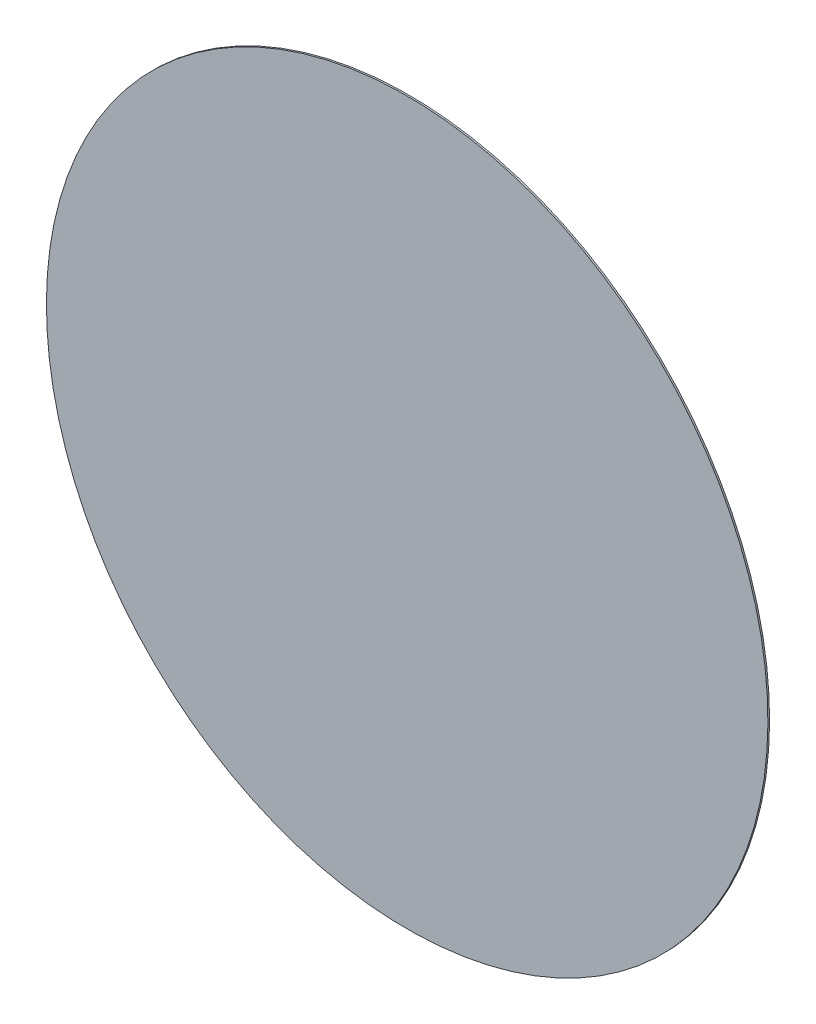
ISO-10303-21;
HEADER;
FILE_DESCRIPTION(('STEP AP214'),'2;1');
FILE_NAME('part.step','',(''),(''),'','','');
FILE_SCHEMA(('AUTOMOTIVE_DESIGN { 1 0 10303 214 1 1 1 1 }'));
ENDSEC;
DATA;
#1=APPLICATION_CONTEXT('core data for automotive mechanical design processes');
#2=APPLICATION_PROTOCOL_DEFINITION('international standard','automotive_design',2000,#1);
#3=PRODUCT_CONTEXT('',#1,'mechanical');
#4=PRODUCT('Part','Part','',(#3));
#5=PRODUCT_RELATED_PRODUCT_CATEGORY('part','',(#4));
#6=PRODUCT_DEFINITION_FORMATION('','',#4);
#7=PRODUCT_DEFINITION_CONTEXT('part definition',#1,'design');
#8=PRODUCT_DEFINITION('design','',#6,#7);
#9=PRODUCT_DEFINITION_SHAPE('','',#8);
#10=(LENGTH_UNIT() NAMED_UNIT(*) SI_UNIT(.MILLI.,.METRE.));
#11=(NAMED_UNIT(*) PLANE_ANGLE_UNIT() SI_UNIT($,.RADIAN.));
#12=(NAMED_UNIT(*) SI_UNIT($,.STERADIAN.) SOLID_ANGLE_UNIT());
#13=UNCERTAINTY_MEASURE_WITH_UNIT(LENGTH_MEASURE(1.E-05),#10,'distance_accuracy_value','');
#14=(GEOMETRIC_REPRESENTATION_CONTEXT(3) GLOBAL_UNCERTAINTY_ASSIGNED_CONTEXT((#13)) GLOBAL_UNIT_ASSIGNED_CONTEXT((#10,
#11,#12)) REPRESENTATION_CONTEXT('',''));
#15=CARTESIAN_POINT('',(0.,0.,0.));
#16=DIRECTION('',(0.,0.,1.));
#17=DIRECTION('',(1.,0.,0.));
#18=AXIS2_PLACEMENT_3D('',#15,#16,#17);
#19=CARTESIAN_POINT('',(17.193,-23.719,0.173));
#20=DIRECTION('',(0.,0.,-1.));
#21=DIRECTION('',(-1.,0.,0.));
#22=AXIS2_PLACEMENT_3D('',#19,#20,#21);
#23=CYLINDRICAL_SURFACE('',#22,37.193);
#24=CARTESIAN_POINT('',(17.193,-23.719,0.));
#25=DIRECTION('',(0.,0.,1.));
#26=DIRECTION('',(1.,0.,0.));
#27=AXIS2_PLACEMENT_3D('',#24,#25,#26);
#28=CIRCLE('',#27,37.193);
#29=CARTESIAN_POINT('',(53.6855864126826,-16.5349631186295,0.));
#30=VERTEX_POINT('',#29);
#31=CARTESIAN_POINT('',(53.6980693346599,-16.5986656067517,0.));
#32=VERTEX_POINT('',#31);
#33=EDGE_CURVE('E74',#30,#32,#28,.T.);
#34=ORIENTED_EDGE('',*,*,#33,.T.);
#35=DIRECTION('',(0.,0.,-1.));
#36=VECTOR('',#35,1.);
#37=CARTESIAN_POINT('',(53.6980693346599,-16.5986656067517,0.173));
#38=LINE('',#37,#36);
#39=CARTESIAN_POINT('',(53.6980693346599,-16.5986656067517,0.173));
#40=VERTEX_POINT('',#39);
#41=EDGE_CURVE('E11',#40,#32,#38,.T.);
#42=ORIENTED_EDGE('',*,*,#41,.F.);
#43=CARTESIAN_POINT('',(17.193,-23.719,0.173));
#44=DIRECTION('',(0.,0.,1.));
#45=DIRECTION('',(1.,0.,0.));
#46=AXIS2_PLACEMENT_3D('',#43,#44,#45);
#47=CIRCLE('',#46,37.193);
#48=CARTESIAN_POINT('',(53.6855864126826,-16.5349631186295,0.173));
#49=VERTEX_POINT('',#48);
#50=EDGE_CURVE('E72',#49,#40,#47,.T.);
#51=ORIENTED_EDGE('',*,*,#50,.F.);
#52=DIRECTION('',(0.,0.,-1.));
#53=VECTOR('',#52,1.);
#54=CARTESIAN_POINT('',(53.6855864126826,-16.5349631186295,0.173));
#55=LINE('',#54,#53);
#56=EDGE_CURVE('E47',#49,#30,#55,.T.);
#57=ORIENTED_EDGE('',*,*,#56,.T.);
#58=EDGE_LOOP('',(#34,#42,#51,#57));
#59=FACE_BOUND('',#58,.T.);
#60=ADVANCED_FACE('F41',(#59),#23,.T.);
#61=CARTESIAN_POINT('',(53.6980693346599,-16.5986656067517,0.173));
#62=DIRECTION('',(-0.981336320581804,-0.192299313329421,0.));
#63=DIRECTION('',(0.192299313329421,-0.981336320581804,0.));
#64=AXIS2_PLACEMENT_3D('',#61,#62,#63);
#65=PLANE('',#64);
#66=DIRECTION('',(-0.192299313329421,0.981336320581804,0.));
#67=VECTOR('',#66,1.);
#68=CARTESIAN_POINT('',(53.6980693346599,-16.5986656067517,0.));
#69=LINE('',#68,#67);
#70=EDGE_CURVE('E61',#32,#30,#69,.T.);
#71=ORIENTED_EDGE('',*,*,#70,.T.);
#72=ORIENTED_EDGE('',*,*,#56,.F.);
#73=DIRECTION('',(-0.192299313329421,0.981336320581804,0.));
#74=VECTOR('',#73,1.);
#75=CARTESIAN_POINT('',(53.6980693346599,-16.5986656067517,0.173));
#76=LINE('',#75,#74);
#77=EDGE_CURVE('E57',#40,#49,#76,.T.);
#78=ORIENTED_EDGE('',*,*,#77,.F.);
#79=ORIENTED_EDGE('',*,*,#41,.T.);
#80=EDGE_LOOP('',(#71,#72,#78,#79));
#81=FACE_BOUND('',#80,.T.);
#82=ADVANCED_FACE('F70',(#81),#65,.F.);
#83=CARTESIAN_POINT('',(17.193,-23.719,0.173));
#84=DIRECTION('',(0.,0.,1.));
#85=DIRECTION('',(1.,0.,0.));
#86=AXIS2_PLACEMENT_3D('',#83,#84,#85);
#87=PLANE('',#86);
#88=ORIENTED_EDGE('',*,*,#50,.T.);
#89=ORIENTED_EDGE('',*,*,#77,.T.);
#90=EDGE_LOOP('',(#88,#89));
#91=FACE_BOUND('',#90,.T.);
#92=ADVANCED_FACE('F80',(#91),#87,.T.);
#93=CARTESIAN_POINT('',(17.193,-23.719,0.));
#94=DIRECTION('',(0.,0.,1.));
#95=DIRECTION('',(1.,0.,0.));
#96=AXIS2_PLACEMENT_3D('',#93,#94,#95);
#97=PLANE('',#96);
#98=ORIENTED_EDGE('',*,*,#33,.F.);
#99=ORIENTED_EDGE('',*,*,#70,.F.);
#100=EDGE_LOOP('',(#98,#99));
#101=FACE_BOUND('',#100,.T.);
#102=ADVANCED_FACE('F73',(#101),#97,.F.);
#103=CLOSED_SHELL('',(#60,#82,#92,#102));
#104=MANIFOLD_SOLID_BREP('B2',#103);
#105=ADVANCED_BREP_SHAPE_REPRESENTATION('',(#18,#104),#14);
#106=SHAPE_DEFINITION_REPRESENTATION(#9,#105);
ENDSEC;
END-ISO-10303-21;
